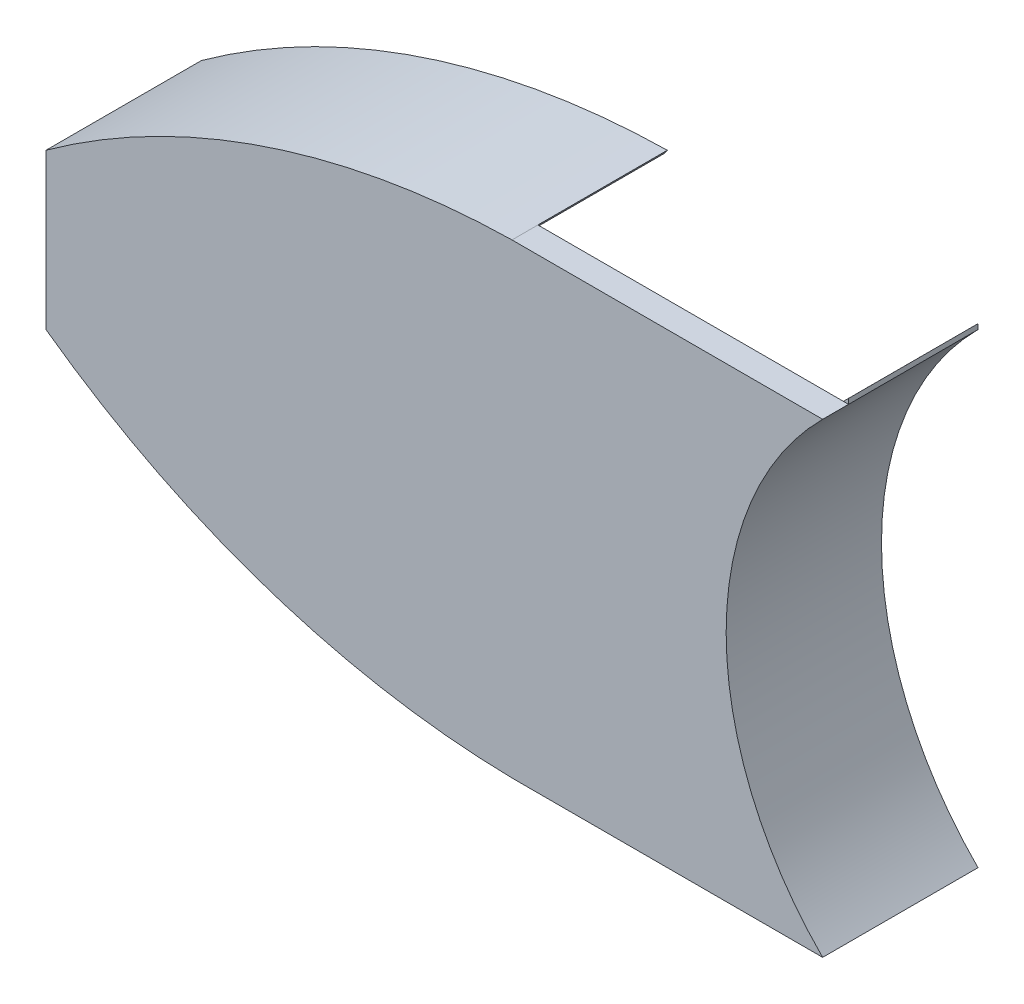
ISO-10303-21;
HEADER;
FILE_DESCRIPTION(('STEP AP214'),'2;1');
FILE_NAME('part.step','',(''),(''),'','','');
FILE_SCHEMA(('AUTOMOTIVE_DESIGN { 1 0 10303 214 1 1 1 1 }'));
ENDSEC;
DATA;
#1=APPLICATION_CONTEXT('core data for automotive mechanical design processes');
#2=APPLICATION_PROTOCOL_DEFINITION('international standard','automotive_design',2000,#1);
#3=PRODUCT_CONTEXT('',#1,'mechanical');
#4=PRODUCT('Part','Part','',(#3));
#5=PRODUCT_RELATED_PRODUCT_CATEGORY('part','',(#4));
#6=PRODUCT_DEFINITION_FORMATION('','',#4);
#7=PRODUCT_DEFINITION_CONTEXT('part definition',#1,'design');
#8=PRODUCT_DEFINITION('design','',#6,#7);
#9=PRODUCT_DEFINITION_SHAPE('','',#8);
#10=(LENGTH_UNIT() NAMED_UNIT(*) SI_UNIT(.MILLI.,.METRE.));
#11=(NAMED_UNIT(*) PLANE_ANGLE_UNIT() SI_UNIT($,.RADIAN.));
#12=(NAMED_UNIT(*) SI_UNIT($,.STERADIAN.) SOLID_ANGLE_UNIT());
#13=UNCERTAINTY_MEASURE_WITH_UNIT(LENGTH_MEASURE(1.E-05),#10,'distance_accuracy_value','');
#14=(GEOMETRIC_REPRESENTATION_CONTEXT(3) GLOBAL_UNCERTAINTY_ASSIGNED_CONTEXT((#13)) GLOBAL_UNIT_ASSIGNED_CONTEXT((#10,
#11,#12)) REPRESENTATION_CONTEXT('',''));
#15=CARTESIAN_POINT('',(0.,0.,0.));
#16=DIRECTION('',(0.,0.,1.));
#17=DIRECTION('',(1.,0.,0.));
#18=AXIS2_PLACEMENT_3D('',#15,#16,#17);
#19=CARTESIAN_POINT('',(90.,90.,0.));
#20=DIRECTION('',(0.,0.,1.));
#21=DIRECTION('',(1.,0.,0.));
#22=AXIS2_PLACEMENT_3D('',#19,#20,#21);
#23=PLANE('',#22);
#24=CARTESIAN_POINT('',(-114.472931586023,-136.58120524193,0.));
#25=DIRECTION('',(0.,0.,1.));
#26=DIRECTION('',(-0.0211754134057513,0.999775775795301,0.));
#27=AXIS2_PLACEMENT_3D('',#24,#25,#26);
#28=CIRCLE('',#27,315.01092548786);
#29=CARTESIAN_POINT('',(-121.143418160556,178.359087171691,0.));
#30=VERTEX_POINT('',#29);
#31=CARTESIAN_POINT('',(-300.,118.,0.));
#32=VERTEX_POINT('',#31);
#33=EDGE_CURVE('E169',#30,#32,#28,.T.);
#34=ORIENTED_EDGE('',*,*,#33,.F.);
#35=DIRECTION('',(0.571709080278297,0.820456414154551,0.));
#36=VECTOR('',#35,1.);
#37=CARTESIAN_POINT('',(-120.,180.,0.));
#38=LINE('',#37,#36);
#39=CARTESIAN_POINT('',(-120.,180.,0.));
#40=VERTEX_POINT('',#39);
#41=EDGE_CURVE('E156',#30,#40,#38,.T.);
#42=ORIENTED_EDGE('',*,*,#41,.T.);
#43=DIRECTION('',(-1.,0.,0.));
#44=VECTOR('',#43,1.);
#45=CARTESIAN_POINT('',(0.,180.,0.));
#46=LINE('',#45,#44);
#47=CARTESIAN_POINT('',(-2.,180.,0.));
#48=VERTEX_POINT('',#47);
#49=EDGE_CURVE('E219',#48,#40,#46,.T.);
#50=ORIENTED_EDGE('',*,*,#49,.F.);
#51=CARTESIAN_POINT('',(90.,90.,0.));
#52=DIRECTION('',(0.,0.,-1.));
#53=DIRECTION('',(-0.714834025585147,-0.699294155463731,0.));
#54=AXIS2_PLACEMENT_3D('',#51,#52,#53);
#55=CIRCLE('',#54,128.701204345569);
#56=CARTESIAN_POINT('',(-2.,0.,0.));
#57=VERTEX_POINT('',#56);
#58=EDGE_CURVE('E57',#57,#48,#55,.T.);
#59=ORIENTED_EDGE('',*,*,#58,.F.);
#60=DIRECTION('',(1.,0.,0.));
#61=VECTOR('',#60,1.);
#62=CARTESIAN_POINT('',(0.,0.,0.));
#63=LINE('',#62,#61);
#64=CARTESIAN_POINT('',(-120.,0.,0.));
#65=VERTEX_POINT('',#64);
#66=EDGE_CURVE('E224',#65,#57,#63,.T.);
#67=ORIENTED_EDGE('',*,*,#66,.F.);
#68=DIRECTION('',(-0.571709080278297,0.820456414154551,0.));
#69=VECTOR('',#68,1.);
#70=CARTESIAN_POINT('',(-120.,0.,0.));
#71=LINE('',#70,#69);
#72=CARTESIAN_POINT('',(-121.143418160556,1.64091282830908,0.));
#73=VERTEX_POINT('',#72);
#74=EDGE_CURVE('E174',#65,#73,#71,.T.);
#75=ORIENTED_EDGE('',*,*,#74,.T.);
#76=CARTESIAN_POINT('',(-114.472931586023,316.58120524193,0.));
#77=DIRECTION('',(0.,0.,1.));
#78=DIRECTION('',(-0.588954393015575,-0.808166271844882,0.));
#79=AXIS2_PLACEMENT_3D('',#76,#77,#78);
#80=CIRCLE('',#79,315.01092548786);
#81=CARTESIAN_POINT('',(-300.,62.0000000000004,0.));
#82=VERTEX_POINT('',#81);
#83=EDGE_CURVE('E49',#82,#73,#80,.T.);
#84=ORIENTED_EDGE('',*,*,#83,.F.);
#85=DIRECTION('',(0.,-1.,0.));
#86=VECTOR('',#85,1.);
#87=CARTESIAN_POINT('',(-300.,60.0000000000004,0.));
#88=LINE('',#87,#86);
#89=EDGE_CURVE('E237',#32,#82,#88,.T.);
#90=ORIENTED_EDGE('',*,*,#89,.F.);
#91=EDGE_LOOP('',(#34,#42,#50,#59,#67,#75,#84,#90));
#92=FACE_BOUND('',#91,.T.);
#93=ADVANCED_FACE('F34',(#92),#23,.F.);
#94=CARTESIAN_POINT('',(90.,90.,10.));
#95=DIRECTION('',(0.,0.,-1.));
#96=DIRECTION('',(-1.,0.,0.));
#97=AXIS2_PLACEMENT_3D('',#94,#95,#96);
#98=CYLINDRICAL_SURFACE('',#97,127.279220613579);
#99=DIRECTION('',(0.,0.,-1.));
#100=VECTOR('',#99,1.);
#101=CARTESIAN_POINT('',(0.,0.,10.));
#102=LINE('',#101,#100);
#103=CARTESIAN_POINT('',(0.,0.,10.));
#104=VERTEX_POINT('',#103);
#105=CARTESIAN_POINT('',(0.,0.,-50.));
#106=VERTEX_POINT('',#105);
#107=EDGE_CURVE('E234',#104,#106,#102,.T.);
#108=ORIENTED_EDGE('',*,*,#107,.T.);
#109=CARTESIAN_POINT('',(90.,90.,-50.));
#110=DIRECTION('',(0.,0.,-1.));
#111=DIRECTION('',(-0.707106781186547,-0.707106781186547,0.));
#112=AXIS2_PLACEMENT_3D('',#109,#110,#111);
#113=CIRCLE('',#112,127.279220613579);
#114=CARTESIAN_POINT('',(0.,180.,-50.));
#115=VERTEX_POINT('',#114);
#116=EDGE_CURVE('E213',#106,#115,#113,.T.);
#117=ORIENTED_EDGE('',*,*,#116,.T.);
#118=DIRECTION('',(0.,0.,1.));
#119=VECTOR('',#118,1.);
#120=CARTESIAN_POINT('',(0.,180.,0.));
#121=LINE('',#120,#119);
#122=CARTESIAN_POINT('',(0.,180.,0.));
#123=VERTEX_POINT('',#122);
#124=EDGE_CURVE('E216',#115,#123,#121,.T.);
#125=ORIENTED_EDGE('',*,*,#124,.T.);
#126=DIRECTION('',(0.,0.,-1.));
#127=VECTOR('',#126,1.);
#128=CARTESIAN_POINT('',(0.,180.,10.));
#129=LINE('',#128,#127);
#130=CARTESIAN_POINT('',(0.,180.,10.));
#131=VERTEX_POINT('',#130);
#132=EDGE_CURVE('E11',#131,#123,#129,.T.);
#133=ORIENTED_EDGE('',*,*,#132,.F.);
#134=CARTESIAN_POINT('',(90.,90.,10.));
#135=DIRECTION('',(0.,0.,-1.));
#136=DIRECTION('',(1.,0.,0.));
#137=AXIS2_PLACEMENT_3D('',#134,#135,#136);
#138=CIRCLE('',#137,127.279220613579);
#139=EDGE_CURVE('E220',#104,#131,#138,.T.);
#140=ORIENTED_EDGE('',*,*,#139,.F.);
#141=EDGE_LOOP('',(#108,#117,#125,#133,#140));
#142=FACE_BOUND('',#141,.T.);
#143=ADVANCED_FACE('F36',(#142),#98,.F.);
#144=CARTESIAN_POINT('',(0.,180.,10.));
#145=DIRECTION('',(0.,-1.,0.));
#146=DIRECTION('',(1.,0.,0.));
#147=AXIS2_PLACEMENT_3D('',#144,#145,#146);
#148=PLANE('',#147);
#149=EDGE_CURVE('E235',#123,#48,#46,.T.);
#150=ORIENTED_EDGE('',*,*,#149,.T.);
#151=ORIENTED_EDGE('',*,*,#49,.T.);
#152=DIRECTION('',(0.,0.,-1.));
#153=VECTOR('',#152,1.);
#154=CARTESIAN_POINT('',(-120.,180.,10.));
#155=LINE('',#154,#153);
#156=CARTESIAN_POINT('',(-120.,180.,10.));
#157=VERTEX_POINT('',#156);
#158=EDGE_CURVE('E42',#157,#40,#155,.T.);
#159=ORIENTED_EDGE('',*,*,#158,.F.);
#160=DIRECTION('',(-1.,0.,0.));
#161=VECTOR('',#160,1.);
#162=CARTESIAN_POINT('',(0.,180.,10.));
#163=LINE('',#162,#161);
#164=EDGE_CURVE('E223',#131,#157,#163,.T.);
#165=ORIENTED_EDGE('',*,*,#164,.F.);
#166=ORIENTED_EDGE('',*,*,#132,.T.);
#167=EDGE_LOOP('',(#150,#151,#159,#165,#166));
#168=FACE_BOUND('',#167,.T.);
#169=ADVANCED_FACE('F258',(#168),#148,.F.);
#170=CARTESIAN_POINT('',(-114.472931586023,-136.58120524193,10.));
#171=DIRECTION('',(0.,0.,-1.));
#172=DIRECTION('',(-1.,0.,0.));
#173=AXIS2_PLACEMENT_3D('',#170,#171,#172);
#174=CYLINDRICAL_SURFACE('',#173,316.629449037335);
#175=ORIENTED_EDGE('',*,*,#158,.T.);
#176=DIRECTION('',(0.,0.,-1.));
#177=VECTOR('',#176,1.);
#178=CARTESIAN_POINT('',(-120.,180.,0.));
#179=LINE('',#178,#177);
#180=CARTESIAN_POINT('',(-120.,180.,-50.));
#181=VERTEX_POINT('',#180);
#182=EDGE_CURVE('E139',#40,#181,#179,.T.);
#183=ORIENTED_EDGE('',*,*,#182,.T.);
#184=CARTESIAN_POINT('',(-114.472931586023,-136.58120524193,-50.));
#185=DIRECTION('',(0.,0.,1.));
#186=DIRECTION('',(-0.0174559518414393,0.999847633264844,0.));
#187=AXIS2_PLACEMENT_3D('',#184,#185,#186);
#188=CIRCLE('',#187,316.629449037335);
#189=CARTESIAN_POINT('',(-300.,120.,-50.));
#190=VERTEX_POINT('',#189);
#191=EDGE_CURVE('E153',#181,#190,#188,.T.);
#192=ORIENTED_EDGE('',*,*,#191,.T.);
#193=DIRECTION('',(0.,0.,-1.));
#194=VECTOR('',#193,1.);
#195=CARTESIAN_POINT('',(-300.,120.,10.));
#196=LINE('',#195,#194);
#197=CARTESIAN_POINT('',(-300.,120.,10.));
#198=VERTEX_POINT('',#197);
#199=EDGE_CURVE('E246',#198,#190,#196,.T.);
#200=ORIENTED_EDGE('',*,*,#199,.F.);
#201=CARTESIAN_POINT('',(-114.472931586023,-136.58120524193,10.));
#202=DIRECTION('',(0.,0.,1.));
#203=DIRECTION('',(-1.,0.,0.));
#204=AXIS2_PLACEMENT_3D('',#201,#202,#203);
#205=CIRCLE('',#204,316.629449037335);
#206=EDGE_CURVE('E226',#157,#198,#205,.T.);
#207=ORIENTED_EDGE('',*,*,#206,.F.);
#208=EDGE_LOOP('',(#175,#183,#192,#200,#207));
#209=FACE_BOUND('',#208,.T.);
#210=ADVANCED_FACE('F151',(#209),#174,.T.);
#211=CARTESIAN_POINT('',(-300.,60.0000000000004,10.));
#212=DIRECTION('',(1.,0.,0.));
#213=DIRECTION('',(0.,0.,-1.));
#214=AXIS2_PLACEMENT_3D('',#211,#212,#213);
#215=PLANE('',#214);
#216=ORIENTED_EDGE('',*,*,#199,.T.);
#217=DIRECTION('',(0.,-1.,0.));
#218=VECTOR('',#217,1.);
#219=CARTESIAN_POINT('',(-300.,120.,-50.));
#220=LINE('',#219,#218);
#221=CARTESIAN_POINT('',(-300.,118.,-50.));
#222=VERTEX_POINT('',#221);
#223=EDGE_CURVE('E160',#190,#222,#220,.T.);
#224=ORIENTED_EDGE('',*,*,#223,.T.);
#225=DIRECTION('',(0.,0.,1.));
#226=VECTOR('',#225,1.);
#227=CARTESIAN_POINT('',(-300.,118.,0.));
#228=LINE('',#227,#226);
#229=EDGE_CURVE('E167',#222,#32,#228,.T.);
#230=ORIENTED_EDGE('',*,*,#229,.T.);
#231=ORIENTED_EDGE('',*,*,#89,.T.);
#232=DIRECTION('',(0.,0.,-1.));
#233=VECTOR('',#232,1.);
#234=CARTESIAN_POINT('',(-300.,62.0000000000004,0.));
#235=LINE('',#234,#233);
#236=CARTESIAN_POINT('',(-300.,62.0000000000004,-50.));
#237=VERTEX_POINT('',#236);
#238=EDGE_CURVE('E172',#82,#237,#235,.T.);
#239=ORIENTED_EDGE('',*,*,#238,.T.);
#240=DIRECTION('',(0.,-1.,0.));
#241=VECTOR('',#240,1.);
#242=CARTESIAN_POINT('',(-300.,60.0000000000004,-50.));
#243=LINE('',#242,#241);
#244=CARTESIAN_POINT('',(-300.,60.0000000000004,-50.));
#245=VERTEX_POINT('',#244);
#246=EDGE_CURVE('E177',#237,#245,#243,.T.);
#247=ORIENTED_EDGE('',*,*,#246,.T.);
#248=DIRECTION('',(0.,0.,-1.));
#249=VECTOR('',#248,1.);
#250=CARTESIAN_POINT('',(-300.,60.0000000000004,10.));
#251=LINE('',#250,#249);
#252=CARTESIAN_POINT('',(-300.,60.0000000000004,10.));
#253=VERTEX_POINT('',#252);
#254=EDGE_CURVE('E244',#253,#245,#251,.T.);
#255=ORIENTED_EDGE('',*,*,#254,.F.);
#256=DIRECTION('',(0.,-1.,0.));
#257=VECTOR('',#256,1.);
#258=CARTESIAN_POINT('',(-300.,60.0000000000004,10.));
#259=LINE('',#258,#257);
#260=EDGE_CURVE('E228',#198,#253,#259,.T.);
#261=ORIENTED_EDGE('',*,*,#260,.F.);
#262=EDGE_LOOP('',(#216,#224,#230,#231,#239,#247,#255,#261));
#263=FACE_BOUND('',#262,.T.);
#264=ADVANCED_FACE('F249',(#263),#215,.F.);
#265=CARTESIAN_POINT('',(-114.472931586023,316.58120524193,10.));
#266=DIRECTION('',(0.,0.,-1.));
#267=DIRECTION('',(-1.,0.,0.));
#268=AXIS2_PLACEMENT_3D('',#265,#266,#267);
#269=CYLINDRICAL_SURFACE('',#268,316.629449037335);
#270=ORIENTED_EDGE('',*,*,#254,.T.);
#271=CARTESIAN_POINT('',(-114.472931586023,316.58120524193,-50.));
#272=DIRECTION('',(0.,0.,1.));
#273=DIRECTION('',(-0.585943818485758,-0.810351677716736,0.));
#274=AXIS2_PLACEMENT_3D('',#271,#272,#273);
#275=CIRCLE('',#274,316.629449037335);
#276=CARTESIAN_POINT('',(-120.,0.,-50.));
#277=VERTEX_POINT('',#276);
#278=EDGE_CURVE('E190',#245,#277,#275,.T.);
#279=ORIENTED_EDGE('',*,*,#278,.T.);
#280=DIRECTION('',(0.,0.,1.));
#281=VECTOR('',#280,1.);
#282=CARTESIAN_POINT('',(-120.,0.,0.));
#283=LINE('',#282,#281);
#284=EDGE_CURVE('E193',#277,#65,#283,.T.);
#285=ORIENTED_EDGE('',*,*,#284,.T.);
#286=DIRECTION('',(0.,0.,-1.));
#287=VECTOR('',#286,1.);
#288=CARTESIAN_POINT('',(-120.,0.,10.));
#289=LINE('',#288,#287);
#290=CARTESIAN_POINT('',(-120.,0.,10.));
#291=VERTEX_POINT('',#290);
#292=EDGE_CURVE('E241',#291,#65,#289,.T.);
#293=ORIENTED_EDGE('',*,*,#292,.F.);
#294=CARTESIAN_POINT('',(-114.472931586023,316.58120524193,10.));
#295=DIRECTION('',(0.,0.,1.));
#296=DIRECTION('',(1.,0.,0.));
#297=AXIS2_PLACEMENT_3D('',#294,#295,#296);
#298=CIRCLE('',#297,316.629449037335);
#299=EDGE_CURVE('E230',#253,#291,#298,.T.);
#300=ORIENTED_EDGE('',*,*,#299,.F.);
#301=EDGE_LOOP('',(#270,#279,#285,#293,#300));
#302=FACE_BOUND('',#301,.T.);
#303=ADVANCED_FACE('F310',(#302),#269,.T.);
#304=CARTESIAN_POINT('',(0.,0.,10.));
#305=DIRECTION('',(0.,1.,0.));
#306=DIRECTION('',(-1.,0.,0.));
#307=AXIS2_PLACEMENT_3D('',#304,#305,#306);
#308=PLANE('',#307);
#309=ORIENTED_EDGE('',*,*,#66,.T.);
#310=DIRECTION('',(0.,0.,-1.));
#311=VECTOR('',#310,1.);
#312=CARTESIAN_POINT('',(-2.,0.,0.));
#313=LINE('',#312,#311);
#314=CARTESIAN_POINT('',(-2.00000000000001,0.,-50.));
#315=VERTEX_POINT('',#314);
#316=EDGE_CURVE('E195',#57,#315,#313,.T.);
#317=ORIENTED_EDGE('',*,*,#316,.T.);
#318=DIRECTION('',(1.,0.,0.));
#319=VECTOR('',#318,1.);
#320=CARTESIAN_POINT('',(0.,0.,-50.));
#321=LINE('',#320,#319);
#322=EDGE_CURVE('E200',#315,#106,#321,.T.);
#323=ORIENTED_EDGE('',*,*,#322,.T.);
#324=ORIENTED_EDGE('',*,*,#107,.F.);
#325=DIRECTION('',(1.,0.,0.));
#326=VECTOR('',#325,1.);
#327=CARTESIAN_POINT('',(0.,0.,10.));
#328=LINE('',#327,#326);
#329=EDGE_CURVE('E232',#291,#104,#328,.T.);
#330=ORIENTED_EDGE('',*,*,#329,.F.);
#331=ORIENTED_EDGE('',*,*,#292,.T.);
#332=EDGE_LOOP('',(#309,#317,#323,#324,#330,#331));
#333=FACE_BOUND('',#332,.T.);
#334=ADVANCED_FACE('F271',(#333),#308,.F.);
#335=CARTESIAN_POINT('',(90.,90.,10.));
#336=DIRECTION('',(0.,0.,1.));
#337=DIRECTION('',(1.,0.,0.));
#338=AXIS2_PLACEMENT_3D('',#335,#336,#337);
#339=PLANE('',#338);
#340=ORIENTED_EDGE('',*,*,#139,.T.);
#341=ORIENTED_EDGE('',*,*,#164,.T.);
#342=ORIENTED_EDGE('',*,*,#206,.T.);
#343=ORIENTED_EDGE('',*,*,#260,.T.);
#344=ORIENTED_EDGE('',*,*,#299,.T.);
#345=ORIENTED_EDGE('',*,*,#329,.T.);
#346=EDGE_LOOP('',(#340,#341,#342,#343,#344,#345));
#347=FACE_BOUND('',#346,.T.);
#348=ADVANCED_FACE('F253',(#347),#339,.T.);
#349=CARTESIAN_POINT('',(0.,180.,0.));
#350=DIRECTION('',(-1.,0.,0.));
#351=DIRECTION('',(0.,-1.,0.));
#352=AXIS2_PLACEMENT_3D('',#349,#350,#351);
#353=PLANE('',#352);
#354=DIRECTION('',(0.,1.,0.));
#355=VECTOR('',#354,1.);
#356=CARTESIAN_POINT('',(0.,180.,0.));
#357=LINE('',#356,#355);
#358=CARTESIAN_POINT('',(0.,182.,0.));
#359=VERTEX_POINT('',#358);
#360=EDGE_CURVE('E196',#123,#359,#357,.T.);
#361=ORIENTED_EDGE('',*,*,#360,.F.);
#362=ORIENTED_EDGE('',*,*,#124,.F.);
#363=DIRECTION('',(0.,-1.,0.));
#364=VECTOR('',#363,1.);
#365=CARTESIAN_POINT('',(0.,180.,-50.));
#366=LINE('',#365,#364);
#367=CARTESIAN_POINT('',(0.,182.,-50.));
#368=VERTEX_POINT('',#367);
#369=EDGE_CURVE('E209',#368,#115,#366,.T.);
#370=ORIENTED_EDGE('',*,*,#369,.F.);
#371=DIRECTION('',(0.,0.,-1.));
#372=VECTOR('',#371,1.);
#373=CARTESIAN_POINT('',(0.,182.,0.));
#374=LINE('',#373,#372);
#375=EDGE_CURVE('E202',#359,#368,#374,.T.);
#376=ORIENTED_EDGE('',*,*,#375,.F.);
#377=EDGE_LOOP('',(#361,#362,#370,#376));
#378=FACE_BOUND('',#377,.T.);
#379=ADVANCED_FACE('F347',(#378),#353,.F.);
#380=CARTESIAN_POINT('',(0.,0.,0.));
#381=DIRECTION('',(0.,0.,-1.));
#382=DIRECTION('',(-1.,0.,0.));
#383=AXIS2_PLACEMENT_3D('',#380,#381,#382);
#384=PLANE('',#383);
#385=ORIENTED_EDGE('',*,*,#149,.F.);
#386=ORIENTED_EDGE('',*,*,#360,.T.);
#387=EDGE_CURVE('E199',#48,#359,#55,.T.);
#388=ORIENTED_EDGE('',*,*,#387,.F.);
#389=EDGE_LOOP('',(#385,#386,#388));
#390=FACE_BOUND('',#389,.T.);
#391=ADVANCED_FACE('F263',(#390),#384,.F.);
#392=CARTESIAN_POINT('',(90.,90.,0.));
#393=DIRECTION('',(0.,0.,-1.));
#394=DIRECTION('',(-1.,0.,0.));
#395=AXIS2_PLACEMENT_3D('',#392,#393,#394);
#396=CYLINDRICAL_SURFACE('',#395,128.701204345569);
#397=CARTESIAN_POINT('',(90.,90.,-50.));
#398=DIRECTION('',(0.,0.,-1.));
#399=DIRECTION('',(-0.714834025585147,-0.699294155463731,0.));
#400=AXIS2_PLACEMENT_3D('',#397,#398,#399);
#401=CIRCLE('',#400,128.701204345569);
#402=EDGE_CURVE('E206',#315,#368,#401,.T.);
#403=ORIENTED_EDGE('',*,*,#402,.F.);
#404=ORIENTED_EDGE('',*,*,#316,.F.);
#405=ORIENTED_EDGE('',*,*,#58,.T.);
#406=ORIENTED_EDGE('',*,*,#387,.T.);
#407=ORIENTED_EDGE('',*,*,#375,.T.);
#408=EDGE_LOOP('',(#403,#404,#405,#406,#407));
#409=FACE_BOUND('',#408,.T.);
#410=ADVANCED_FACE('F269',(#409),#396,.T.);
#411=CARTESIAN_POINT('',(0.,0.,-50.));
#412=DIRECTION('',(0.,0.,1.));
#413=DIRECTION('',(1.,0.,0.));
#414=AXIS2_PLACEMENT_3D('',#411,#412,#413);
#415=PLANE('',#414);
#416=ORIENTED_EDGE('',*,*,#116,.F.);
#417=ORIENTED_EDGE('',*,*,#322,.F.);
#418=ORIENTED_EDGE('',*,*,#402,.T.);
#419=ORIENTED_EDGE('',*,*,#369,.T.);
#420=EDGE_LOOP('',(#416,#417,#418,#419));
#421=FACE_BOUND('',#420,.T.);
#422=ADVANCED_FACE('F297',(#421),#415,.F.);
#423=CARTESIAN_POINT('',(-85.6974551833017,-49.2273848492734,0.));
#424=DIRECTION('',(-0.820456414154551,-0.571709080278297,0.));
#425=DIRECTION('',(0.,0.,1.));
#426=AXIS2_PLACEMENT_3D('',#423,#424,#425);
#427=PLANE('',#426);
#428=ORIENTED_EDGE('',*,*,#74,.F.);
#429=ORIENTED_EDGE('',*,*,#284,.F.);
#430=DIRECTION('',(0.571709080278297,-0.820456414154551,0.));
#431=VECTOR('',#430,1.);
#432=CARTESIAN_POINT('',(-120.,0.,-50.));
#433=LINE('',#432,#431);
#434=CARTESIAN_POINT('',(-121.143418160556,1.6409128283091,-50.));
#435=VERTEX_POINT('',#434);
#436=EDGE_CURVE('E186',#435,#277,#433,.T.);
#437=ORIENTED_EDGE('',*,*,#436,.F.);
#438=DIRECTION('',(0.,0.,-1.));
#439=VECTOR('',#438,1.);
#440=CARTESIAN_POINT('',(-121.143418160556,1.64091282830911,0.));
#441=LINE('',#440,#439);
#442=EDGE_CURVE('E179',#73,#435,#441,.T.);
#443=ORIENTED_EDGE('',*,*,#442,.F.);
#444=EDGE_LOOP('',(#428,#429,#437,#443));
#445=FACE_BOUND('',#444,.T.);
#446=ADVANCED_FACE('F280',(#445),#427,.F.);
#447=CARTESIAN_POINT('',(-114.472931586023,316.58120524193,0.));
#448=DIRECTION('',(0.,0.,1.));
#449=DIRECTION('',(1.,0.,0.));
#450=AXIS2_PLACEMENT_3D('',#447,#448,#449);
#451=CYLINDRICAL_SURFACE('',#450,315.01092548786);
#452=CARTESIAN_POINT('',(-114.472931586023,316.58120524193,-50.));
#453=DIRECTION('',(0.,0.,1.));
#454=DIRECTION('',(-0.588954393015575,-0.808166271844882,0.));
#455=AXIS2_PLACEMENT_3D('',#452,#453,#454);
#456=CIRCLE('',#455,315.01092548786);
#457=EDGE_CURVE('E183',#237,#435,#456,.T.);
#458=ORIENTED_EDGE('',*,*,#457,.F.);
#459=ORIENTED_EDGE('',*,*,#238,.F.);
#460=ORIENTED_EDGE('',*,*,#83,.T.);
#461=ORIENTED_EDGE('',*,*,#442,.T.);
#462=EDGE_LOOP('',(#458,#459,#460,#461));
#463=FACE_BOUND('',#462,.T.);
#464=ADVANCED_FACE('F283',(#463),#451,.F.);
#465=CARTESIAN_POINT('',(-300.,60.0000000000004,-50.));
#466=DIRECTION('',(0.,0.,1.));
#467=DIRECTION('',(1.,0.,0.));
#468=AXIS2_PLACEMENT_3D('',#465,#466,#467);
#469=PLANE('',#468);
#470=ORIENTED_EDGE('',*,*,#278,.F.);
#471=ORIENTED_EDGE('',*,*,#246,.F.);
#472=ORIENTED_EDGE('',*,*,#457,.T.);
#473=ORIENTED_EDGE('',*,*,#436,.T.);
#474=EDGE_LOOP('',(#470,#471,#472,#473));
#475=FACE_BOUND('',#474,.T.);
#476=ADVANCED_FACE('F286',(#475),#469,.F.);
#477=CARTESIAN_POINT('',(-188.605089633395,81.5452303014543,0.));
#478=DIRECTION('',(0.820456414154551,-0.571709080278297,0.));
#479=DIRECTION('',(0.,0.,-1.));
#480=AXIS2_PLACEMENT_3D('',#477,#478,#479);
#481=PLANE('',#480);
#482=ORIENTED_EDGE('',*,*,#41,.F.);
#483=DIRECTION('',(0.,0.,1.));
#484=VECTOR('',#483,1.);
#485=CARTESIAN_POINT('',(-121.143418160556,178.359087171691,0.));
#486=LINE('',#485,#484);
#487=CARTESIAN_POINT('',(-121.143418160556,178.359087171691,-50.));
#488=VERTEX_POINT('',#487);
#489=EDGE_CURVE('E142',#488,#30,#486,.T.);
#490=ORIENTED_EDGE('',*,*,#489,.F.);
#491=DIRECTION('',(-0.571709080278297,-0.820456414154551,0.));
#492=VECTOR('',#491,1.);
#493=CARTESIAN_POINT('',(-120.,180.,-50.));
#494=LINE('',#493,#492);
#495=EDGE_CURVE('E136',#181,#488,#494,.T.);
#496=ORIENTED_EDGE('',*,*,#495,.F.);
#497=ORIENTED_EDGE('',*,*,#182,.F.);
#498=EDGE_LOOP('',(#482,#490,#496,#497));
#499=FACE_BOUND('',#498,.T.);
#500=ADVANCED_FACE('F138',(#499),#481,.T.);
#501=CARTESIAN_POINT('',(-120.,180.,-50.));
#502=DIRECTION('',(0.,0.,-1.));
#503=DIRECTION('',(-1.,0.,0.));
#504=AXIS2_PLACEMENT_3D('',#501,#502,#503);
#505=PLANE('',#504);
#506=CARTESIAN_POINT('',(-114.472931586023,-136.58120524193,-50.));
#507=DIRECTION('',(0.,0.,1.));
#508=DIRECTION('',(-0.0211754134057513,0.999775775795301,0.));
#509=AXIS2_PLACEMENT_3D('',#506,#507,#508);
#510=CIRCLE('',#509,315.01092548786);
#511=EDGE_CURVE('E162',#488,#222,#510,.T.);
#512=ORIENTED_EDGE('',*,*,#511,.T.);
#513=ORIENTED_EDGE('',*,*,#223,.F.);
#514=ORIENTED_EDGE('',*,*,#191,.F.);
#515=ORIENTED_EDGE('',*,*,#495,.T.);
#516=EDGE_LOOP('',(#512,#513,#514,#515));
#517=FACE_BOUND('',#516,.T.);
#518=ADVANCED_FACE('F159',(#517),#505,.T.);
#519=CARTESIAN_POINT('',(-114.472931586023,-136.58120524193,0.));
#520=DIRECTION('',(0.,0.,1.));
#521=DIRECTION('',(1.,0.,0.));
#522=AXIS2_PLACEMENT_3D('',#519,#520,#521);
#523=CYLINDRICAL_SURFACE('',#522,315.01092548786);
#524=ORIENTED_EDGE('',*,*,#33,.T.);
#525=ORIENTED_EDGE('',*,*,#229,.F.);
#526=ORIENTED_EDGE('',*,*,#511,.F.);
#527=ORIENTED_EDGE('',*,*,#489,.T.);
#528=EDGE_LOOP('',(#524,#525,#526,#527));
#529=FACE_BOUND('',#528,.T.);
#530=ADVANCED_FACE('F288',(#529),#523,.F.);
#531=CLOSED_SHELL('',(#93,#143,#169,#210,#264,#303,#334,#348,#379,#391,#410,#422,#446,#464,#476,
#500,#518,#530));
#532=MANIFOLD_SOLID_BREP('B2',#531);
#533=ADVANCED_BREP_SHAPE_REPRESENTATION('',(#18,#532),#14);
#534=SHAPE_DEFINITION_REPRESENTATION(#9,#533);
ENDSEC;
END-ISO-10303-21;
